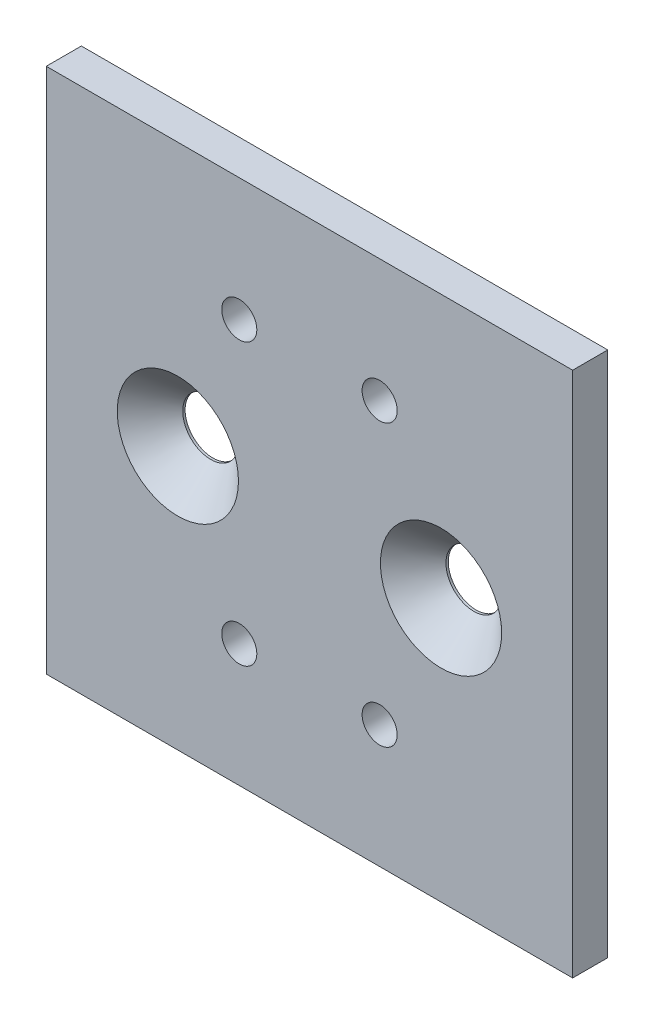
ISO-10303-21;
HEADER;
FILE_DESCRIPTION(('STEP AP214'),'2;1');
FILE_NAME('part.step','',(''),(''),'','','');
FILE_SCHEMA(('AUTOMOTIVE_DESIGN { 1 0 10303 214 1 1 1 1 }'));
ENDSEC;
DATA;
#1=APPLICATION_CONTEXT('core data for automotive mechanical design processes');
#2=APPLICATION_PROTOCOL_DEFINITION('international standard','automotive_design',2000,#1);
#3=PRODUCT_CONTEXT('',#1,'mechanical');
#4=PRODUCT('Part','Part','',(#3));
#5=PRODUCT_RELATED_PRODUCT_CATEGORY('part','',(#4));
#6=PRODUCT_DEFINITION_FORMATION('','',#4);
#7=PRODUCT_DEFINITION_CONTEXT('part definition',#1,'design');
#8=PRODUCT_DEFINITION('design','',#6,#7);
#9=PRODUCT_DEFINITION_SHAPE('','',#8);
#10=(LENGTH_UNIT() NAMED_UNIT(*) SI_UNIT(.MILLI.,.METRE.));
#11=(NAMED_UNIT(*) PLANE_ANGLE_UNIT() SI_UNIT($,.RADIAN.));
#12=(NAMED_UNIT(*) SI_UNIT($,.STERADIAN.) SOLID_ANGLE_UNIT());
#13=UNCERTAINTY_MEASURE_WITH_UNIT(LENGTH_MEASURE(1.E-05),#10,'distance_accuracy_value','');
#14=(GEOMETRIC_REPRESENTATION_CONTEXT(3) GLOBAL_UNCERTAINTY_ASSIGNED_CONTEXT((#13)) GLOBAL_UNIT_ASSIGNED_CONTEXT((#10,
#11,#12)) REPRESENTATION_CONTEXT('',''));
#15=CARTESIAN_POINT('',(0.,0.,0.));
#16=DIRECTION('',(0.,0.,1.));
#17=DIRECTION('',(1.,0.,0.));
#18=AXIS2_PLACEMENT_3D('',#15,#16,#17);
#19=CARTESIAN_POINT('',(0.,0.,2.));
#20=DIRECTION('',(0.,0.,-1.));
#21=DIRECTION('',(-1.,0.,0.));
#22=AXIS2_PLACEMENT_3D('',#19,#20,#21);
#23=PLANE('',#22);
#24=CARTESIAN_POINT('',(22.,46.,2.));
#25=DIRECTION('',(0.,0.,1.));
#26=DIRECTION('',(1.,0.,0.));
#27=AXIS2_PLACEMENT_3D('',#24,#25,#26);
#28=CIRCLE('',#27,2.);
#29=CARTESIAN_POINT('',(24.,46.,2.));
#30=VERTEX_POINT('',#29);
#31=EDGE_CURVE('E280',#30,#30,#28,.T.);
#32=ORIENTED_EDGE('',*,*,#31,.F.);
#33=EDGE_LOOP('',(#32));
#34=FACE_BOUND('',#33,.T.);
#35=CARTESIAN_POINT('',(38.,46.,2.));
#36=DIRECTION('',(0.,0.,1.));
#37=DIRECTION('',(1.,0.,0.));
#38=AXIS2_PLACEMENT_3D('',#35,#36,#37);
#39=CIRCLE('',#38,2.);
#40=CARTESIAN_POINT('',(40.,46.,2.));
#41=VERTEX_POINT('',#40);
#42=EDGE_CURVE('E286',#41,#41,#39,.T.);
#43=ORIENTED_EDGE('',*,*,#42,.F.);
#44=EDGE_LOOP('',(#43));
#45=FACE_BOUND('',#44,.T.);
#46=CARTESIAN_POINT('',(38.,14.,2.));
#47=DIRECTION('',(0.,0.,1.));
#48=DIRECTION('',(1.,0.,0.));
#49=AXIS2_PLACEMENT_3D('',#46,#47,#48);
#50=CIRCLE('',#49,2.);
#51=CARTESIAN_POINT('',(40.,14.,2.));
#52=VERTEX_POINT('',#51);
#53=EDGE_CURVE('E292',#52,#52,#50,.T.);
#54=ORIENTED_EDGE('',*,*,#53,.F.);
#55=EDGE_LOOP('',(#54));
#56=FACE_BOUND('',#55,.T.);
#57=CARTESIAN_POINT('',(22.,14.,2.));
#58=DIRECTION('',(0.,0.,1.));
#59=DIRECTION('',(1.,0.,0.));
#60=AXIS2_PLACEMENT_3D('',#57,#58,#59);
#61=CIRCLE('',#60,2.);
#62=CARTESIAN_POINT('',(24.,14.,2.));
#63=VERTEX_POINT('',#62);
#64=EDGE_CURVE('E273',#63,#63,#61,.T.);
#65=ORIENTED_EDGE('',*,*,#64,.F.);
#66=EDGE_LOOP('',(#65));
#67=FACE_BOUND('',#66,.T.);
#68=CARTESIAN_POINT('',(45.,30.,2.));
#69=DIRECTION('',(0.,0.,1.));
#70=DIRECTION('',(1.,0.,0.));
#71=AXIS2_PLACEMENT_3D('',#68,#69,#70);
#72=CIRCLE('',#71,6.9088);
#73=CARTESIAN_POINT('',(51.9088,30.,2.));
#74=VERTEX_POINT('',#73);
#75=EDGE_CURVE('E119',#74,#74,#72,.T.);
#76=ORIENTED_EDGE('',*,*,#75,.F.);
#77=EDGE_LOOP('',(#76));
#78=FACE_BOUND('',#77,.T.);
#79=CARTESIAN_POINT('',(15.,30.,2.));
#80=DIRECTION('',(0.,0.,1.));
#81=DIRECTION('',(1.,0.,0.));
#82=AXIS2_PLACEMENT_3D('',#79,#80,#81);
#83=CIRCLE('',#82,6.9088);
#84=CARTESIAN_POINT('',(21.9088,30.,2.));
#85=VERTEX_POINT('',#84);
#86=EDGE_CURVE('E109',#85,#85,#83,.T.);
#87=ORIENTED_EDGE('',*,*,#86,.F.);
#88=EDGE_LOOP('',(#87));
#89=FACE_BOUND('',#88,.T.);
#90=DIRECTION('',(1.,0.,0.));
#91=VECTOR('',#90,1.);
#92=CARTESIAN_POINT('',(60.,0.,2.));
#93=LINE('',#92,#91);
#94=CARTESIAN_POINT('',(0.,0.,2.));
#95=VERTEX_POINT('',#94);
#96=CARTESIAN_POINT('',(60.,0.,2.));
#97=VERTEX_POINT('',#96);
#98=EDGE_CURVE('E85',#95,#97,#93,.T.);
#99=ORIENTED_EDGE('',*,*,#98,.T.);
#100=DIRECTION('',(0.,1.,0.));
#101=VECTOR('',#100,1.);
#102=CARTESIAN_POINT('',(60.,60.,2.));
#103=LINE('',#102,#101);
#104=CARTESIAN_POINT('',(60.,60.,2.));
#105=VERTEX_POINT('',#104);
#106=EDGE_CURVE('E81',#97,#105,#103,.T.);
#107=ORIENTED_EDGE('',*,*,#106,.T.);
#108=DIRECTION('',(-1.,0.,0.));
#109=VECTOR('',#108,1.);
#110=CARTESIAN_POINT('',(60.,60.,2.));
#111=LINE('',#110,#109);
#112=CARTESIAN_POINT('',(0.,60.,2.));
#113=VERTEX_POINT('',#112);
#114=EDGE_CURVE('E83',#105,#113,#111,.T.);
#115=ORIENTED_EDGE('',*,*,#114,.T.);
#116=DIRECTION('',(0.,-1.,0.));
#117=VECTOR('',#116,1.);
#118=CARTESIAN_POINT('',(0.,0.,2.));
#119=LINE('',#118,#117);
#120=EDGE_CURVE('E51',#113,#95,#119,.T.);
#121=ORIENTED_EDGE('',*,*,#120,.T.);
#122=EDGE_LOOP('',(#99,#107,#115,#121));
#123=FACE_BOUND('',#122,.T.);
#124=ADVANCED_FACE('F32',(#34,#45,#56,#67,#78,#89,#123),#23,.F.);
#125=CARTESIAN_POINT('',(0.,0.,-2.));
#126=DIRECTION('',(0.,0.,-1.));
#127=DIRECTION('',(-1.,0.,0.));
#128=AXIS2_PLACEMENT_3D('',#125,#126,#127);
#129=PLANE('',#128);
#130=CARTESIAN_POINT('',(22.,46.,-2.));
#131=DIRECTION('',(0.,0.,1.));
#132=DIRECTION('',(1.,0.,0.));
#133=AXIS2_PLACEMENT_3D('',#130,#131,#132);
#134=CIRCLE('',#133,2.);
#135=CARTESIAN_POINT('',(24.,46.,-2.));
#136=VERTEX_POINT('',#135);
#137=EDGE_CURVE('E283',#136,#136,#134,.T.);
#138=ORIENTED_EDGE('',*,*,#137,.T.);
#139=EDGE_LOOP('',(#138));
#140=FACE_BOUND('',#139,.T.);
#141=CARTESIAN_POINT('',(38.,46.,-2.));
#142=DIRECTION('',(0.,0.,1.));
#143=DIRECTION('',(1.,0.,0.));
#144=AXIS2_PLACEMENT_3D('',#141,#142,#143);
#145=CIRCLE('',#144,2.);
#146=CARTESIAN_POINT('',(40.,46.,-2.));
#147=VERTEX_POINT('',#146);
#148=EDGE_CURVE('E289',#147,#147,#145,.T.);
#149=ORIENTED_EDGE('',*,*,#148,.T.);
#150=EDGE_LOOP('',(#149));
#151=FACE_BOUND('',#150,.T.);
#152=CARTESIAN_POINT('',(38.,14.,-2.));
#153=DIRECTION('',(0.,0.,1.));
#154=DIRECTION('',(1.,0.,0.));
#155=AXIS2_PLACEMENT_3D('',#152,#153,#154);
#156=CIRCLE('',#155,2.);
#157=CARTESIAN_POINT('',(40.,14.,-2.));
#158=VERTEX_POINT('',#157);
#159=EDGE_CURVE('E278',#158,#158,#156,.T.);
#160=ORIENTED_EDGE('',*,*,#159,.T.);
#161=EDGE_LOOP('',(#160));
#162=FACE_BOUND('',#161,.T.);
#163=CARTESIAN_POINT('',(22.,14.,-2.));
#164=DIRECTION('',(0.,0.,1.));
#165=DIRECTION('',(1.,0.,0.));
#166=AXIS2_PLACEMENT_3D('',#163,#164,#165);
#167=CIRCLE('',#166,2.);
#168=CARTESIAN_POINT('',(24.,14.,-2.));
#169=VERTEX_POINT('',#168);
#170=EDGE_CURVE('E271',#169,#169,#167,.T.);
#171=ORIENTED_EDGE('',*,*,#170,.T.);
#172=EDGE_LOOP('',(#171));
#173=FACE_BOUND('',#172,.T.);
#174=CARTESIAN_POINT('',(15.,30.,-2.));
#175=DIRECTION('',(0.,0.,1.));
#176=DIRECTION('',(1.,0.,0.));
#177=AXIS2_PLACEMENT_3D('',#174,#175,#176);
#178=CIRCLE('',#177,3.175);
#179=CARTESIAN_POINT('',(18.175,30.,-2.));
#180=VERTEX_POINT('',#179);
#181=EDGE_CURVE('E101',#180,#180,#178,.T.);
#182=ORIENTED_EDGE('',*,*,#181,.T.);
#183=EDGE_LOOP('',(#182));
#184=FACE_BOUND('',#183,.T.);
#185=DIRECTION('',(1.,0.,0.));
#186=VECTOR('',#185,1.);
#187=CARTESIAN_POINT('',(60.,0.,-2.));
#188=LINE('',#187,#186);
#189=CARTESIAN_POINT('',(0.,0.,-2.));
#190=VERTEX_POINT('',#189);
#191=CARTESIAN_POINT('',(60.,0.,-2.));
#192=VERTEX_POINT('',#191);
#193=EDGE_CURVE('E98',#190,#192,#188,.T.);
#194=ORIENTED_EDGE('',*,*,#193,.F.);
#195=DIRECTION('',(0.,-1.,0.));
#196=VECTOR('',#195,1.);
#197=CARTESIAN_POINT('',(0.,0.,-2.));
#198=LINE('',#197,#196);
#199=CARTESIAN_POINT('',(0.,60.,-2.));
#200=VERTEX_POINT('',#199);
#201=EDGE_CURVE('E74',#200,#190,#198,.T.);
#202=ORIENTED_EDGE('',*,*,#201,.F.);
#203=DIRECTION('',(-1.,0.,0.));
#204=VECTOR('',#203,1.);
#205=CARTESIAN_POINT('',(60.,60.,-2.));
#206=LINE('',#205,#204);
#207=CARTESIAN_POINT('',(60.,60.,-2.));
#208=VERTEX_POINT('',#207);
#209=EDGE_CURVE('E68',#208,#200,#206,.T.);
#210=ORIENTED_EDGE('',*,*,#209,.F.);
#211=DIRECTION('',(0.,1.,0.));
#212=VECTOR('',#211,1.);
#213=CARTESIAN_POINT('',(60.,60.,-2.));
#214=LINE('',#213,#212);
#215=EDGE_CURVE('E89',#192,#208,#214,.T.);
#216=ORIENTED_EDGE('',*,*,#215,.F.);
#217=EDGE_LOOP('',(#194,#202,#210,#216));
#218=FACE_BOUND('',#217,.T.);
#219=CARTESIAN_POINT('',(45.,30.,-2.));
#220=DIRECTION('',(0.,0.,1.));
#221=DIRECTION('',(1.,0.,0.));
#222=AXIS2_PLACEMENT_3D('',#219,#220,#221);
#223=CIRCLE('',#222,3.175);
#224=CARTESIAN_POINT('',(48.175,30.,-2.));
#225=VERTEX_POINT('',#224);
#226=EDGE_CURVE('E108',#225,#225,#223,.T.);
#227=ORIENTED_EDGE('',*,*,#226,.T.);
#228=EDGE_LOOP('',(#227));
#229=FACE_BOUND('',#228,.T.);
#230=ADVANCED_FACE('F126',(#140,#151,#162,#173,#184,#218,#229),#129,.T.);
#231=CARTESIAN_POINT('',(60.,0.,2.));
#232=DIRECTION('',(0.,1.,0.));
#233=DIRECTION('',(-1.,0.,0.));
#234=AXIS2_PLACEMENT_3D('',#231,#232,#233);
#235=PLANE('',#234);
#236=ORIENTED_EDGE('',*,*,#193,.T.);
#237=DIRECTION('',(0.,0.,-1.));
#238=VECTOR('',#237,1.);
#239=CARTESIAN_POINT('',(60.,0.,2.));
#240=LINE('',#239,#238);
#241=EDGE_CURVE('E11',#97,#192,#240,.T.);
#242=ORIENTED_EDGE('',*,*,#241,.F.);
#243=ORIENTED_EDGE('',*,*,#98,.F.);
#244=DIRECTION('',(0.,0.,-1.));
#245=VECTOR('',#244,1.);
#246=CARTESIAN_POINT('',(0.,0.,2.));
#247=LINE('',#246,#245);
#248=EDGE_CURVE('E94',#95,#190,#247,.T.);
#249=ORIENTED_EDGE('',*,*,#248,.T.);
#250=EDGE_LOOP('',(#236,#242,#243,#249));
#251=FACE_BOUND('',#250,.T.);
#252=ADVANCED_FACE('F34',(#251),#235,.F.);
#253=CARTESIAN_POINT('',(60.,60.,2.));
#254=DIRECTION('',(-1.,0.,0.));
#255=DIRECTION('',(0.,-1.,0.));
#256=AXIS2_PLACEMENT_3D('',#253,#254,#255);
#257=PLANE('',#256);
#258=ORIENTED_EDGE('',*,*,#215,.T.);
#259=DIRECTION('',(0.,0.,-1.));
#260=VECTOR('',#259,1.);
#261=CARTESIAN_POINT('',(60.,60.,2.));
#262=LINE('',#261,#260);
#263=EDGE_CURVE('E42',#105,#208,#262,.T.);
#264=ORIENTED_EDGE('',*,*,#263,.F.);
#265=ORIENTED_EDGE('',*,*,#106,.F.);
#266=ORIENTED_EDGE('',*,*,#241,.T.);
#267=EDGE_LOOP('',(#258,#264,#265,#266));
#268=FACE_BOUND('',#267,.T.);
#269=ADVANCED_FACE('F88',(#268),#257,.F.);
#270=CARTESIAN_POINT('',(60.,60.,2.));
#271=DIRECTION('',(0.,-1.,0.));
#272=DIRECTION('',(1.,0.,0.));
#273=AXIS2_PLACEMENT_3D('',#270,#271,#272);
#274=PLANE('',#273);
#275=ORIENTED_EDGE('',*,*,#209,.T.);
#276=DIRECTION('',(0.,0.,-1.));
#277=VECTOR('',#276,1.);
#278=CARTESIAN_POINT('',(0.,60.,2.));
#279=LINE('',#278,#277);
#280=EDGE_CURVE('E90',#113,#200,#279,.T.);
#281=ORIENTED_EDGE('',*,*,#280,.F.);
#282=ORIENTED_EDGE('',*,*,#114,.F.);
#283=ORIENTED_EDGE('',*,*,#263,.T.);
#284=EDGE_LOOP('',(#275,#281,#282,#283));
#285=FACE_BOUND('',#284,.T.);
#286=ADVANCED_FACE('F92',(#285),#274,.F.);
#287=CARTESIAN_POINT('',(0.,0.,2.));
#288=DIRECTION('',(1.,0.,0.));
#289=DIRECTION('',(0.,0.,-1.));
#290=AXIS2_PLACEMENT_3D('',#287,#288,#289);
#291=PLANE('',#290);
#292=ORIENTED_EDGE('',*,*,#201,.T.);
#293=ORIENTED_EDGE('',*,*,#248,.F.);
#294=ORIENTED_EDGE('',*,*,#120,.F.);
#295=ORIENTED_EDGE('',*,*,#280,.T.);
#296=EDGE_LOOP('',(#292,#293,#294,#295));
#297=FACE_BOUND('',#296,.T.);
#298=ADVANCED_FACE('F132',(#297),#291,.F.);
#299=CARTESIAN_POINT('',(15.,30.,2.));
#300=DIRECTION('',(0.,0.,-1.));
#301=DIRECTION('',(-1.,0.,0.));
#302=AXIS2_PLACEMENT_3D('',#299,#300,#301);
#303=CYLINDRICAL_SURFACE('',#302,3.175);
#304=CARTESIAN_POINT('',(15.,30.,-1.73379999999998));
#305=DIRECTION('',(0.,0.,1.));
#306=DIRECTION('',(1.,0.,0.));
#307=AXIS2_PLACEMENT_3D('',#304,#305,#306);
#308=CIRCLE('',#307,3.175);
#309=CARTESIAN_POINT('',(18.175,30.,-1.73379999999998));
#310=VERTEX_POINT('',#309);
#311=EDGE_CURVE('E106',#310,#310,#308,.F.);
#312=ORIENTED_EDGE('',*,*,#311,.F.);
#313=EDGE_LOOP('',(#312));
#314=FACE_BOUND('',#313,.T.);
#315=ORIENTED_EDGE('',*,*,#181,.F.);
#316=EDGE_LOOP('',(#315));
#317=FACE_BOUND('',#316,.T.);
#318=ADVANCED_FACE('F129',(#314,#317),#303,.F.);
#319=CARTESIAN_POINT('',(45.,30.,2.));
#320=DIRECTION('',(0.,0.,-1.));
#321=DIRECTION('',(-1.,0.,0.));
#322=AXIS2_PLACEMENT_3D('',#319,#320,#321);
#323=CYLINDRICAL_SURFACE('',#322,3.175);
#324=CARTESIAN_POINT('',(45.,30.,-1.73379999999999));
#325=DIRECTION('',(0.,0.,1.));
#326=DIRECTION('',(1.,0.,0.));
#327=AXIS2_PLACEMENT_3D('',#324,#325,#326);
#328=CIRCLE('',#327,3.175);
#329=CARTESIAN_POINT('',(48.175,30.,-1.73379999999999));
#330=VERTEX_POINT('',#329);
#331=EDGE_CURVE('E36',#330,#330,#328,.F.);
#332=ORIENTED_EDGE('',*,*,#331,.F.);
#333=EDGE_LOOP('',(#332));
#334=FACE_BOUND('',#333,.T.);
#335=ORIENTED_EDGE('',*,*,#226,.F.);
#336=EDGE_LOOP('',(#335));
#337=FACE_BOUND('',#336,.T.);
#338=ADVANCED_FACE('F131',(#334,#337),#323,.F.);
#339=CARTESIAN_POINT('',(15.,30.,2.));
#340=DIRECTION('',(0.,0.,1.));
#341=DIRECTION('',(1.,0.,0.));
#342=AXIS2_PLACEMENT_3D('',#339,#340,#341);
#343=CONICAL_SURFACE('',#342,6.9088,0.78539816339745);
#344=ORIENTED_EDGE('',*,*,#311,.T.);
#345=EDGE_LOOP('',(#344));
#346=FACE_BOUND('',#345,.T.);
#347=ORIENTED_EDGE('',*,*,#86,.T.);
#348=EDGE_LOOP('',(#347));
#349=FACE_BOUND('',#348,.T.);
#350=ADVANCED_FACE('F139',(#346,#349),#343,.F.);
#351=CARTESIAN_POINT('',(45.,30.,2.));
#352=DIRECTION('',(0.,0.,1.));
#353=DIRECTION('',(1.,0.,0.));
#354=AXIS2_PLACEMENT_3D('',#351,#352,#353);
#355=CONICAL_SURFACE('',#354,6.9088,0.78539816339745);
#356=ORIENTED_EDGE('',*,*,#331,.T.);
#357=EDGE_LOOP('',(#356));
#358=FACE_BOUND('',#357,.T.);
#359=ORIENTED_EDGE('',*,*,#75,.T.);
#360=EDGE_LOOP('',(#359));
#361=FACE_BOUND('',#360,.T.);
#362=ADVANCED_FACE('F186',(#358,#361),#355,.F.);
#363=CARTESIAN_POINT('',(22.,14.,-2.));
#364=DIRECTION('',(0.,0.,1.));
#365=DIRECTION('',(1.,0.,0.));
#366=AXIS2_PLACEMENT_3D('',#363,#364,#365);
#367=CYLINDRICAL_SURFACE('',#366,2.);
#368=ORIENTED_EDGE('',*,*,#170,.F.);
#369=EDGE_LOOP('',(#368));
#370=FACE_BOUND('',#369,.T.);
#371=ORIENTED_EDGE('',*,*,#64,.T.);
#372=EDGE_LOOP('',(#371));
#373=FACE_BOUND('',#372,.T.);
#374=ADVANCED_FACE('F180',(#370,#373),#367,.F.);
#375=CARTESIAN_POINT('',(38.,14.,-2.));
#376=DIRECTION('',(0.,0.,1.));
#377=DIRECTION('',(1.,0.,0.));
#378=AXIS2_PLACEMENT_3D('',#375,#376,#377);
#379=CYLINDRICAL_SURFACE('',#378,2.);
#380=ORIENTED_EDGE('',*,*,#159,.F.);
#381=EDGE_LOOP('',(#380));
#382=FACE_BOUND('',#381,.T.);
#383=ORIENTED_EDGE('',*,*,#53,.T.);
#384=EDGE_LOOP('',(#383));
#385=FACE_BOUND('',#384,.T.);
#386=ADVANCED_FACE('F185',(#382,#385),#379,.F.);
#387=CARTESIAN_POINT('',(38.,46.,-2.));
#388=DIRECTION('',(0.,0.,1.));
#389=DIRECTION('',(1.,0.,0.));
#390=AXIS2_PLACEMENT_3D('',#387,#388,#389);
#391=CYLINDRICAL_SURFACE('',#390,2.);
#392=ORIENTED_EDGE('',*,*,#148,.F.);
#393=EDGE_LOOP('',(#392));
#394=FACE_BOUND('',#393,.T.);
#395=ORIENTED_EDGE('',*,*,#42,.T.);
#396=EDGE_LOOP('',(#395));
#397=FACE_BOUND('',#396,.T.);
#398=ADVANCED_FACE('F198',(#394,#397),#391,.F.);
#399=CARTESIAN_POINT('',(22.,46.,-2.));
#400=DIRECTION('',(0.,0.,1.));
#401=DIRECTION('',(1.,0.,0.));
#402=AXIS2_PLACEMENT_3D('',#399,#400,#401);
#403=CYLINDRICAL_SURFACE('',#402,2.);
#404=ORIENTED_EDGE('',*,*,#137,.F.);
#405=EDGE_LOOP('',(#404));
#406=FACE_BOUND('',#405,.T.);
#407=ORIENTED_EDGE('',*,*,#31,.T.);
#408=EDGE_LOOP('',(#407));
#409=FACE_BOUND('',#408,.T.);
#410=ADVANCED_FACE('F208',(#406,#409),#403,.F.);
#411=CLOSED_SHELL('',(#124,#230,#252,#269,#286,#298,#318,#338,#350,#362,#374,#386,#398,#410));
#412=MANIFOLD_SOLID_BREP('B2',#411);
#413=ADVANCED_BREP_SHAPE_REPRESENTATION('',(#18,#412),#14);
#414=SHAPE_DEFINITION_REPRESENTATION(#9,#413);
ENDSEC;
END-ISO-10303-21;
